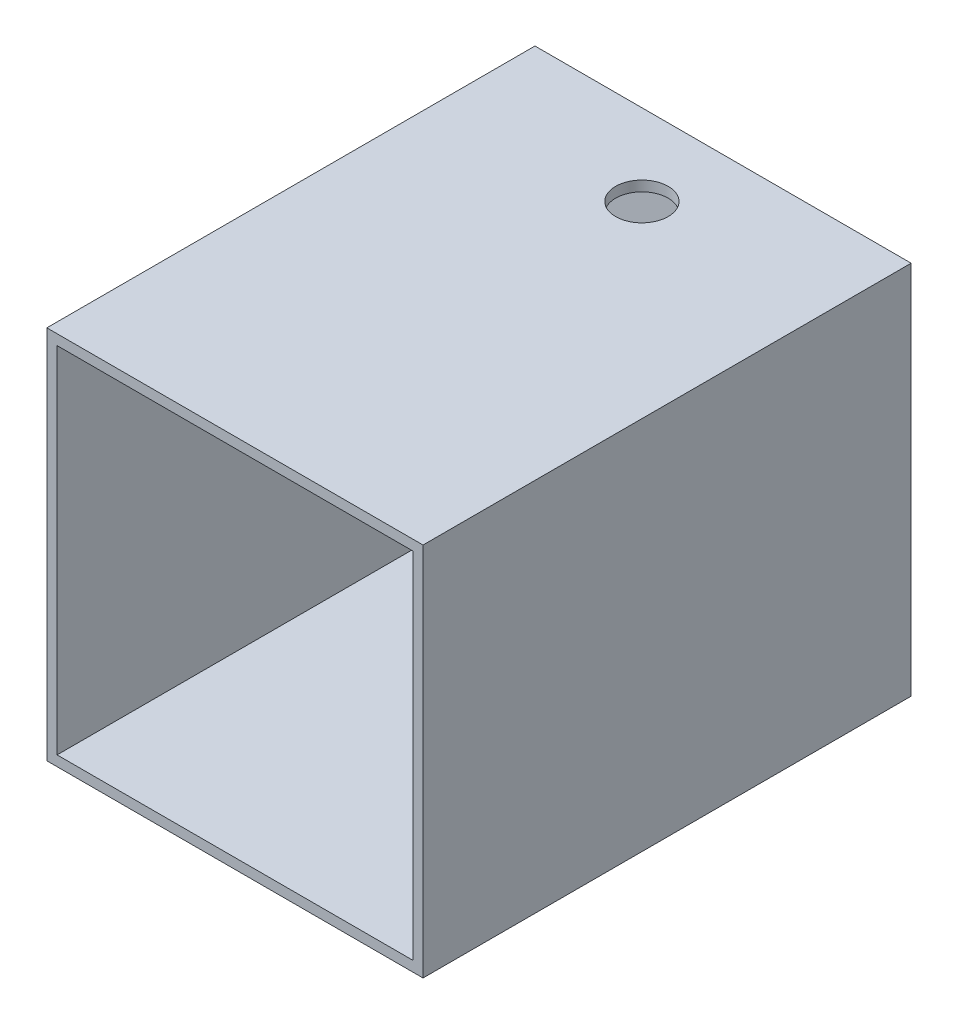
ISO-10303-21;
HEADER;
FILE_DESCRIPTION(('STEP AP214'),'2;1');
FILE_NAME('part.step','',(''),(''),'','','');
FILE_SCHEMA(('AUTOMOTIVE_DESIGN { 1 0 10303 214 1 1 1 1 }'));
ENDSEC;
DATA;
#1=APPLICATION_CONTEXT('core data for automotive mechanical design processes');
#2=APPLICATION_PROTOCOL_DEFINITION('international standard','automotive_design',2000,#1);
#3=PRODUCT_CONTEXT('',#1,'mechanical');
#4=PRODUCT('Part','Part','',(#3));
#5=PRODUCT_RELATED_PRODUCT_CATEGORY('part','',(#4));
#6=PRODUCT_DEFINITION_FORMATION('','',#4);
#7=PRODUCT_DEFINITION_CONTEXT('part definition',#1,'design');
#8=PRODUCT_DEFINITION('design','',#6,#7);
#9=PRODUCT_DEFINITION_SHAPE('','',#8);
#10=(LENGTH_UNIT() NAMED_UNIT(*) SI_UNIT(.MILLI.,.METRE.));
#11=(NAMED_UNIT(*) PLANE_ANGLE_UNIT() SI_UNIT($,.RADIAN.));
#12=(NAMED_UNIT(*) SI_UNIT($,.STERADIAN.) SOLID_ANGLE_UNIT());
#13=UNCERTAINTY_MEASURE_WITH_UNIT(LENGTH_MEASURE(1.E-05),#10,'distance_accuracy_value','');
#14=(GEOMETRIC_REPRESENTATION_CONTEXT(3) GLOBAL_UNCERTAINTY_ASSIGNED_CONTEXT((#13)) GLOBAL_UNIT_ASSIGNED_CONTEXT((#10,
#11,#12)) REPRESENTATION_CONTEXT('',''));
#15=CARTESIAN_POINT('',(0.,0.,0.));
#16=DIRECTION('',(0.,0.,1.));
#17=DIRECTION('',(1.,0.,0.));
#18=AXIS2_PLACEMENT_3D('',#15,#16,#17);
#19=CARTESIAN_POINT('',(-74.5,74.25,204.5));
#20=DIRECTION('',(0.,-1.,0.));
#21=DIRECTION('',(0.,0.,-1.));
#22=AXIS2_PLACEMENT_3D('',#19,#20,#21);
#23=PLANE('',#22);
#24=CARTESIAN_POINT('',(0.,74.25,34.));
#25=DIRECTION('',(0.,-1.,0.));
#26=DIRECTION('',(0.,0.,-1.));
#27=AXIS2_PLACEMENT_3D('',#24,#25,#26);
#28=CIRCLE('',#27,11.);
#29=CARTESIAN_POINT('',(0.,74.25,23.));
#30=VERTEX_POINT('',#29);
#31=EDGE_CURVE('E218',#30,#30,#28,.T.);
#32=ORIENTED_EDGE('',*,*,#31,.F.);
#33=EDGE_LOOP('',(#32));
#34=FACE_BOUND('',#33,.T.);
#35=DIRECTION('',(0.,0.,-1.));
#36=VECTOR('',#35,1.);
#37=CARTESIAN_POINT('',(-74.5,74.25,204.5));
#38=LINE('',#37,#36);
#39=CARTESIAN_POINT('',(-74.5,74.25,204.5));
#40=VERTEX_POINT('',#39);
#41=CARTESIAN_POINT('',(-74.5,74.25,4.));
#42=VERTEX_POINT('',#41);
#43=EDGE_CURVE('E117',#40,#42,#38,.T.);
#44=ORIENTED_EDGE('',*,*,#43,.T.);
#45=DIRECTION('',(1.,0.,0.));
#46=VECTOR('',#45,1.);
#47=CARTESIAN_POINT('',(-74.5,74.25,4.));
#48=LINE('',#47,#46);
#49=CARTESIAN_POINT('',(74.5,74.25,4.));
#50=VERTEX_POINT('',#49);
#51=EDGE_CURVE('E108',#42,#50,#48,.T.);
#52=ORIENTED_EDGE('',*,*,#51,.T.);
#53=DIRECTION('',(0.,0.,-1.));
#54=VECTOR('',#53,1.);
#55=CARTESIAN_POINT('',(74.5,74.25,204.5));
#56=LINE('',#55,#54);
#57=CARTESIAN_POINT('',(74.5,74.25,204.5));
#58=VERTEX_POINT('',#57);
#59=EDGE_CURVE('E114',#58,#50,#56,.T.);
#60=ORIENTED_EDGE('',*,*,#59,.F.);
#61=DIRECTION('',(-1.,0.,0.));
#62=VECTOR('',#61,1.);
#63=CARTESIAN_POINT('',(-74.5,74.25,204.5));
#64=LINE('',#63,#62);
#65=EDGE_CURVE('E119',#58,#40,#64,.T.);
#66=ORIENTED_EDGE('',*,*,#65,.T.);
#67=EDGE_LOOP('',(#44,#52,#60,#66));
#68=FACE_BOUND('',#67,.T.);
#69=ADVANCED_FACE('F44',(#34,#68),#23,.T.);
#70=CARTESIAN_POINT('',(-74.5,74.25,204.5));
#71=DIRECTION('',(1.,0.,0.));
#72=DIRECTION('',(0.,0.,-1.));
#73=AXIS2_PLACEMENT_3D('',#70,#71,#72);
#74=PLANE('',#73);
#75=DIRECTION('',(0.,0.,-1.));
#76=VECTOR('',#75,1.);
#77=CARTESIAN_POINT('',(-74.5,-74.25,204.5));
#78=LINE('',#77,#76);
#79=CARTESIAN_POINT('',(-74.5,-74.25,204.5));
#80=VERTEX_POINT('',#79);
#81=CARTESIAN_POINT('',(-74.5,-74.25,3.99999999999998));
#82=VERTEX_POINT('',#81);
#83=EDGE_CURVE('E128',#80,#82,#78,.T.);
#84=ORIENTED_EDGE('',*,*,#83,.T.);
#85=DIRECTION('',(0.,-1.,0.));
#86=VECTOR('',#85,1.);
#87=CARTESIAN_POINT('',(-74.5,78.55,4.));
#88=LINE('',#87,#86);
#89=EDGE_CURVE('E215',#42,#82,#88,.T.);
#90=ORIENTED_EDGE('',*,*,#89,.F.);
#91=ORIENTED_EDGE('',*,*,#43,.F.);
#92=DIRECTION('',(0.,-1.,0.));
#93=VECTOR('',#92,1.);
#94=CARTESIAN_POINT('',(-74.5,74.25,204.5));
#95=LINE('',#94,#93);
#96=EDGE_CURVE('E204',#40,#80,#95,.T.);
#97=ORIENTED_EDGE('',*,*,#96,.T.);
#98=EDGE_LOOP('',(#84,#90,#91,#97));
#99=FACE_BOUND('',#98,.T.);
#100=ADVANCED_FACE('F247',(#99),#74,.T.);
#101=CARTESIAN_POINT('',(-74.5,-74.25,204.5));
#102=DIRECTION('',(0.,1.,0.));
#103=DIRECTION('',(0.,0.,1.));
#104=AXIS2_PLACEMENT_3D('',#101,#102,#103);
#105=PLANE('',#104);
#106=CARTESIAN_POINT('',(0.,-74.25,34.));
#107=DIRECTION('',(0.,1.,0.));
#108=DIRECTION('',(0.,0.,1.));
#109=AXIS2_PLACEMENT_3D('',#106,#107,#108);
#110=CIRCLE('',#109,11.);
#111=CARTESIAN_POINT('',(0.,-74.25,45.));
#112=VERTEX_POINT('',#111);
#113=EDGE_CURVE('E222',#112,#112,#110,.T.);
#114=ORIENTED_EDGE('',*,*,#113,.F.);
#115=EDGE_LOOP('',(#114));
#116=FACE_BOUND('',#115,.T.);
#117=DIRECTION('',(0.,0.,-1.));
#118=VECTOR('',#117,1.);
#119=CARTESIAN_POINT('',(74.5,-74.25,204.5));
#120=LINE('',#119,#118);
#121=CARTESIAN_POINT('',(74.5,-74.25,204.5));
#122=VERTEX_POINT('',#121);
#123=CARTESIAN_POINT('',(74.5,-74.25,4.));
#124=VERTEX_POINT('',#123);
#125=EDGE_CURVE('E66',#122,#124,#120,.T.);
#126=ORIENTED_EDGE('',*,*,#125,.T.);
#127=DIRECTION('',(-1.,0.,0.));
#128=VECTOR('',#127,1.);
#129=CARTESIAN_POINT('',(-74.5,-74.25,3.99999999999998));
#130=LINE('',#129,#128);
#131=EDGE_CURVE('E60',#124,#82,#130,.T.);
#132=ORIENTED_EDGE('',*,*,#131,.T.);
#133=ORIENTED_EDGE('',*,*,#83,.F.);
#134=DIRECTION('',(1.,0.,0.));
#135=VECTOR('',#134,1.);
#136=CARTESIAN_POINT('',(-74.5,-74.25,204.5));
#137=LINE('',#136,#135);
#138=EDGE_CURVE('E130',#80,#122,#137,.T.);
#139=ORIENTED_EDGE('',*,*,#138,.T.);
#140=EDGE_LOOP('',(#126,#132,#133,#139));
#141=FACE_BOUND('',#140,.T.);
#142=ADVANCED_FACE('F255',(#116,#141),#105,.T.);
#143=CARTESIAN_POINT('',(74.5,74.25,204.5));
#144=DIRECTION('',(-1.,0.,0.));
#145=DIRECTION('',(0.,0.,1.));
#146=AXIS2_PLACEMENT_3D('',#143,#144,#145);
#147=PLANE('',#146);
#148=ORIENTED_EDGE('',*,*,#59,.T.);
#149=DIRECTION('',(0.,-1.,0.));
#150=VECTOR('',#149,1.);
#151=CARTESIAN_POINT('',(74.5,74.25,4.));
#152=LINE('',#151,#150);
#153=EDGE_CURVE('E11',#50,#124,#152,.T.);
#154=ORIENTED_EDGE('',*,*,#153,.T.);
#155=ORIENTED_EDGE('',*,*,#125,.F.);
#156=DIRECTION('',(0.,1.,0.));
#157=VECTOR('',#156,1.);
#158=CARTESIAN_POINT('',(74.5,74.25,204.5));
#159=LINE('',#158,#157);
#160=EDGE_CURVE('E123',#122,#58,#159,.T.);
#161=ORIENTED_EDGE('',*,*,#160,.T.);
#162=EDGE_LOOP('',(#148,#154,#155,#161));
#163=FACE_BOUND('',#162,.T.);
#164=ADVANCED_FACE('F121',(#163),#147,.T.);
#165=CARTESIAN_POINT('',(0.,0.,204.5));
#166=DIRECTION('',(0.,0.,1.));
#167=DIRECTION('',(1.,0.,0.));
#168=AXIS2_PLACEMENT_3D('',#165,#166,#167);
#169=PLANE('',#168);
#170=DIRECTION('',(0.,1.,0.));
#171=VECTOR('',#170,1.);
#172=CARTESIAN_POINT('',(78.8,78.55,204.5));
#173=LINE('',#172,#171);
#174=CARTESIAN_POINT('',(78.8,-78.55,204.5));
#175=VERTEX_POINT('',#174);
#176=CARTESIAN_POINT('',(78.8,78.55,204.5));
#177=VERTEX_POINT('',#176);
#178=EDGE_CURVE('E140',#175,#177,#173,.T.);
#179=ORIENTED_EDGE('',*,*,#178,.T.);
#180=DIRECTION('',(-1.,0.,0.));
#181=VECTOR('',#180,1.);
#182=CARTESIAN_POINT('',(-78.8,78.55,204.5));
#183=LINE('',#182,#181);
#184=CARTESIAN_POINT('',(-78.8,78.55,204.5));
#185=VERTEX_POINT('',#184);
#186=EDGE_CURVE('E144',#177,#185,#183,.T.);
#187=ORIENTED_EDGE('',*,*,#186,.T.);
#188=DIRECTION('',(0.,-1.,0.));
#189=VECTOR('',#188,1.);
#190=CARTESIAN_POINT('',(-78.8,78.55,204.5));
#191=LINE('',#190,#189);
#192=CARTESIAN_POINT('',(-78.8,-78.55,204.5));
#193=VERTEX_POINT('',#192);
#194=EDGE_CURVE('E148',#185,#193,#191,.T.);
#195=ORIENTED_EDGE('',*,*,#194,.T.);
#196=DIRECTION('',(1.,0.,0.));
#197=VECTOR('',#196,1.);
#198=CARTESIAN_POINT('',(-78.8,-78.55,204.5));
#199=LINE('',#198,#197);
#200=EDGE_CURVE('E151',#193,#175,#199,.T.);
#201=ORIENTED_EDGE('',*,*,#200,.T.);
#202=EDGE_LOOP('',(#179,#187,#195,#201));
#203=FACE_BOUND('',#202,.T.);
#204=ORIENTED_EDGE('',*,*,#96,.F.);
#205=ORIENTED_EDGE('',*,*,#65,.F.);
#206=ORIENTED_EDGE('',*,*,#160,.F.);
#207=ORIENTED_EDGE('',*,*,#138,.F.);
#208=EDGE_LOOP('',(#204,#205,#206,#207));
#209=FACE_BOUND('',#208,.T.);
#210=ADVANCED_FACE('F198',(#203,#209),#169,.T.);
#211=CARTESIAN_POINT('',(0.,0.,0.));
#212=DIRECTION('',(0.,0.,1.));
#213=DIRECTION('',(1.,0.,0.));
#214=AXIS2_PLACEMENT_3D('',#211,#212,#213);
#215=PLANE('',#214);
#216=DIRECTION('',(0.,1.,0.));
#217=VECTOR('',#216,1.);
#218=CARTESIAN_POINT('',(78.8,78.55,0.));
#219=LINE('',#218,#217);
#220=CARTESIAN_POINT('',(78.8,-78.55,0.));
#221=VERTEX_POINT('',#220);
#222=CARTESIAN_POINT('',(78.8,78.55,0.));
#223=VERTEX_POINT('',#222);
#224=EDGE_CURVE('E139',#221,#223,#219,.T.);
#225=ORIENTED_EDGE('',*,*,#224,.F.);
#226=DIRECTION('',(1.,0.,0.));
#227=VECTOR('',#226,1.);
#228=CARTESIAN_POINT('',(-78.8,-78.55,0.));
#229=LINE('',#228,#227);
#230=CARTESIAN_POINT('',(-78.8,-78.55,0.));
#231=VERTEX_POINT('',#230);
#232=EDGE_CURVE('E145',#231,#221,#229,.T.);
#233=ORIENTED_EDGE('',*,*,#232,.F.);
#234=DIRECTION('',(0.,-1.,0.));
#235=VECTOR('',#234,1.);
#236=CARTESIAN_POINT('',(-78.8,78.55,0.));
#237=LINE('',#236,#235);
#238=CARTESIAN_POINT('',(-78.8,78.55,0.));
#239=VERTEX_POINT('',#238);
#240=EDGE_CURVE('E161',#239,#231,#237,.T.);
#241=ORIENTED_EDGE('',*,*,#240,.F.);
#242=DIRECTION('',(-1.,0.,0.));
#243=VECTOR('',#242,1.);
#244=CARTESIAN_POINT('',(-78.8,78.55,0.));
#245=LINE('',#244,#243);
#246=EDGE_CURVE('E158',#223,#239,#245,.T.);
#247=ORIENTED_EDGE('',*,*,#246,.F.);
#248=EDGE_LOOP('',(#225,#233,#241,#247));
#249=FACE_BOUND('',#248,.T.);
#250=ADVANCED_FACE('F188',(#249),#215,.F.);
#251=CARTESIAN_POINT('',(78.8,78.55,204.5));
#252=DIRECTION('',(-1.,0.,0.));
#253=DIRECTION('',(0.,-1.,0.));
#254=AXIS2_PLACEMENT_3D('',#251,#252,#253);
#255=PLANE('',#254);
#256=ORIENTED_EDGE('',*,*,#224,.T.);
#257=DIRECTION('',(0.,0.,-1.));
#258=VECTOR('',#257,1.);
#259=CARTESIAN_POINT('',(78.8,78.55,204.5));
#260=LINE('',#259,#258);
#261=EDGE_CURVE('E53',#177,#223,#260,.T.);
#262=ORIENTED_EDGE('',*,*,#261,.F.);
#263=ORIENTED_EDGE('',*,*,#178,.F.);
#264=DIRECTION('',(0.,0.,-1.));
#265=VECTOR('',#264,1.);
#266=CARTESIAN_POINT('',(78.8,-78.55,204.5));
#267=LINE('',#266,#265);
#268=EDGE_CURVE('E154',#175,#221,#267,.T.);
#269=ORIENTED_EDGE('',*,*,#268,.T.);
#270=EDGE_LOOP('',(#256,#262,#263,#269));
#271=FACE_BOUND('',#270,.T.);
#272=ADVANCED_FACE('F46',(#271),#255,.F.);
#273=CARTESIAN_POINT('',(-78.8,78.55,204.5));
#274=DIRECTION('',(0.,-1.,0.));
#275=DIRECTION('',(0.,0.,-1.));
#276=AXIS2_PLACEMENT_3D('',#273,#274,#275);
#277=PLANE('',#276);
#278=CARTESIAN_POINT('',(0.,78.55,34.));
#279=DIRECTION('',(0.,-1.,0.));
#280=DIRECTION('',(0.,0.,-1.));
#281=AXIS2_PLACEMENT_3D('',#278,#279,#280);
#282=CIRCLE('',#281,11.);
#283=CARTESIAN_POINT('',(0.,78.55,23.));
#284=VERTEX_POINT('',#283);
#285=EDGE_CURVE('E226',#284,#284,#282,.T.);
#286=ORIENTED_EDGE('',*,*,#285,.T.);
#287=EDGE_LOOP('',(#286));
#288=FACE_BOUND('',#287,.T.);
#289=ORIENTED_EDGE('',*,*,#246,.T.);
#290=DIRECTION('',(0.,0.,-1.));
#291=VECTOR('',#290,1.);
#292=CARTESIAN_POINT('',(-78.8,78.55,204.5));
#293=LINE('',#292,#291);
#294=EDGE_CURVE('E173',#185,#239,#293,.T.);
#295=ORIENTED_EDGE('',*,*,#294,.F.);
#296=ORIENTED_EDGE('',*,*,#186,.F.);
#297=ORIENTED_EDGE('',*,*,#261,.T.);
#298=EDGE_LOOP('',(#289,#295,#296,#297));
#299=FACE_BOUND('',#298,.T.);
#300=ADVANCED_FACE('F180',(#288,#299),#277,.F.);
#301=CARTESIAN_POINT('',(-78.8,78.55,204.5));
#302=DIRECTION('',(1.,0.,0.));
#303=DIRECTION('',(0.,1.,0.));
#304=AXIS2_PLACEMENT_3D('',#301,#302,#303);
#305=PLANE('',#304);
#306=ORIENTED_EDGE('',*,*,#240,.T.);
#307=DIRECTION('',(0.,0.,-1.));
#308=VECTOR('',#307,1.);
#309=CARTESIAN_POINT('',(-78.8,-78.55,204.5));
#310=LINE('',#309,#308);
#311=EDGE_CURVE('E169',#193,#231,#310,.T.);
#312=ORIENTED_EDGE('',*,*,#311,.F.);
#313=ORIENTED_EDGE('',*,*,#194,.F.);
#314=ORIENTED_EDGE('',*,*,#294,.T.);
#315=EDGE_LOOP('',(#306,#312,#313,#314));
#316=FACE_BOUND('',#315,.T.);
#317=ADVANCED_FACE('F192',(#316),#305,.F.);
#318=CARTESIAN_POINT('',(-78.8,-78.55,204.5));
#319=DIRECTION('',(0.,1.,0.));
#320=DIRECTION('',(0.,0.,1.));
#321=AXIS2_PLACEMENT_3D('',#318,#319,#320);
#322=PLANE('',#321);
#323=CARTESIAN_POINT('',(0.,-78.55,34.));
#324=DIRECTION('',(0.,-1.,0.));
#325=DIRECTION('',(0.,0.,-1.));
#326=AXIS2_PLACEMENT_3D('',#323,#324,#325);
#327=CIRCLE('',#326,11.);
#328=CARTESIAN_POINT('',(0.,-78.55,23.));
#329=VERTEX_POINT('',#328);
#330=EDGE_CURVE('E227',#329,#329,#327,.T.);
#331=ORIENTED_EDGE('',*,*,#330,.F.);
#332=EDGE_LOOP('',(#331));
#333=FACE_BOUND('',#332,.T.);
#334=ORIENTED_EDGE('',*,*,#232,.T.);
#335=ORIENTED_EDGE('',*,*,#268,.F.);
#336=ORIENTED_EDGE('',*,*,#200,.F.);
#337=ORIENTED_EDGE('',*,*,#311,.T.);
#338=EDGE_LOOP('',(#334,#335,#336,#337));
#339=FACE_BOUND('',#338,.T.);
#340=ADVANCED_FACE('F196',(#333,#339),#322,.F.);
#341=CARTESIAN_POINT('',(231.650914728486,78.55,4.));
#342=DIRECTION('',(0.,0.,-1.));
#343=DIRECTION('',(0.,1.,0.));
#344=AXIS2_PLACEMENT_3D('',#341,#342,#343);
#345=PLANE('',#344);
#346=ORIENTED_EDGE('',*,*,#51,.F.);
#347=ORIENTED_EDGE('',*,*,#89,.T.);
#348=ORIENTED_EDGE('',*,*,#131,.F.);
#349=ORIENTED_EDGE('',*,*,#153,.F.);
#350=EDGE_LOOP('',(#346,#347,#348,#349));
#351=FACE_BOUND('',#350,.T.);
#352=ADVANCED_FACE('F107',(#351),#345,.F.);
#353=CARTESIAN_POINT('',(0.,78.55,34.));
#354=DIRECTION('',(0.,-1.,0.));
#355=DIRECTION('',(0.,0.,-1.));
#356=AXIS2_PLACEMENT_3D('',#353,#354,#355);
#357=CYLINDRICAL_SURFACE('',#356,11.);
#358=ORIENTED_EDGE('',*,*,#113,.T.);
#359=EDGE_LOOP('',(#358));
#360=FACE_BOUND('',#359,.T.);
#361=ORIENTED_EDGE('',*,*,#330,.T.);
#362=EDGE_LOOP('',(#361));
#363=FACE_BOUND('',#362,.T.);
#364=ADVANCED_FACE('F238',(#360,#363),#357,.F.);
#365=ORIENTED_EDGE('',*,*,#31,.T.);
#366=EDGE_LOOP('',(#365));
#367=FACE_BOUND('',#366,.T.);
#368=ORIENTED_EDGE('',*,*,#285,.F.);
#369=EDGE_LOOP('',(#368));
#370=FACE_BOUND('',#369,.T.);
#371=ADVANCED_FACE('F236',(#367,#370),#357,.F.);
#372=CLOSED_SHELL('',(#69,#100,#142,#164,#210,#250,#272,#300,#317,#340,#352,#364,#371));
#373=MANIFOLD_SOLID_BREP('B2',#372);
#374=ADVANCED_BREP_SHAPE_REPRESENTATION('',(#18,#373),#14);
#375=SHAPE_DEFINITION_REPRESENTATION(#9,#374);
ENDSEC;
END-ISO-10303-21;
